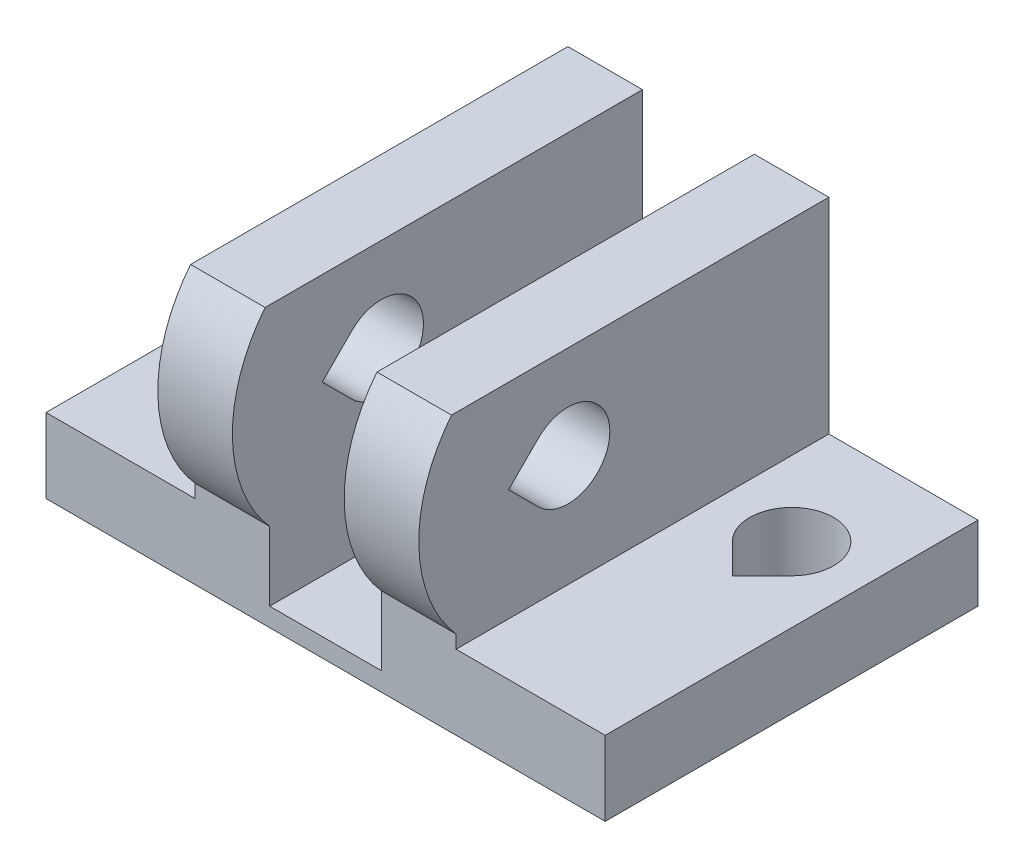
ISO-10303-21;
HEADER;
FILE_DESCRIPTION(('STEP AP214'),'2;1');
FILE_NAME('part.step','',(''),(''),'','','');
FILE_SCHEMA(('AUTOMOTIVE_DESIGN { 1 0 10303 214 1 1 1 1 }'));
ENDSEC;
DATA;
#1=APPLICATION_CONTEXT('core data for automotive mechanical design processes');
#2=APPLICATION_PROTOCOL_DEFINITION('international standard','automotive_design',2000,#1);
#3=PRODUCT_CONTEXT('',#1,'mechanical');
#4=PRODUCT('Part','Part','',(#3));
#5=PRODUCT_RELATED_PRODUCT_CATEGORY('part','',(#4));
#6=PRODUCT_DEFINITION_FORMATION('','',#4);
#7=PRODUCT_DEFINITION_CONTEXT('part definition',#1,'design');
#8=PRODUCT_DEFINITION('design','',#6,#7);
#9=PRODUCT_DEFINITION_SHAPE('','',#8);
#10=(LENGTH_UNIT() NAMED_UNIT(*) SI_UNIT(.MILLI.,.METRE.));
#11=(NAMED_UNIT(*) PLANE_ANGLE_UNIT() SI_UNIT($,.RADIAN.));
#12=(NAMED_UNIT(*) SI_UNIT($,.STERADIAN.) SOLID_ANGLE_UNIT());
#13=UNCERTAINTY_MEASURE_WITH_UNIT(LENGTH_MEASURE(1.E-05),#10,'distance_accuracy_value','');
#14=(GEOMETRIC_REPRESENTATION_CONTEXT(3) GLOBAL_UNCERTAINTY_ASSIGNED_CONTEXT((#13)) GLOBAL_UNIT_ASSIGNED_CONTEXT((#10,
#11,#12)) REPRESENTATION_CONTEXT('',''));
#15=CARTESIAN_POINT('',(0.,0.,0.));
#16=DIRECTION('',(0.,0.,1.));
#17=DIRECTION('',(1.,0.,0.));
#18=AXIS2_PLACEMENT_3D('',#15,#16,#17);
#19=CARTESIAN_POINT('',(0.,0.,20.));
#20=DIRECTION('',(0.,0.,1.));
#21=DIRECTION('',(1.,0.,0.));
#22=AXIS2_PLACEMENT_3D('',#19,#20,#21);
#23=PLANE('',#22);
#24=DIRECTION('',(0.,1.,0.));
#25=VECTOR('',#24,1.);
#26=CARTESIAN_POINT('',(-3.,4.,20.));
#27=LINE('',#26,#25);
#28=CARTESIAN_POINT('',(-3.,1.,20.));
#29=VERTEX_POINT('',#28);
#30=CARTESIAN_POINT('',(-3.,4.70849737787082,20.));
#31=VERTEX_POINT('',#30);
#32=EDGE_CURVE('E47',#29,#31,#27,.T.);
#33=ORIENTED_EDGE('',*,*,#32,.T.);
#34=DIRECTION('',(-1.,0.,0.));
#35=VECTOR('',#34,1.);
#36=CARTESIAN_POINT('',(-3.,4.70849737787082,20.));
#37=LINE('',#36,#35);
#38=CARTESIAN_POINT('',(-7.,4.70849737787082,20.));
#39=VERTEX_POINT('',#38);
#40=EDGE_CURVE('E237',#31,#39,#37,.T.);
#41=ORIENTED_EDGE('',*,*,#40,.T.);
#42=DIRECTION('',(0.,-1.,0.));
#43=VECTOR('',#42,1.);
#44=CARTESIAN_POINT('',(-7.,15.,20.));
#45=LINE('',#44,#43);
#46=CARTESIAN_POINT('',(-7.,4.,20.));
#47=VERTEX_POINT('',#46);
#48=EDGE_CURVE('E372',#39,#47,#45,.T.);
#49=ORIENTED_EDGE('',*,*,#48,.T.);
#50=DIRECTION('',(-1.,0.,0.));
#51=VECTOR('',#50,1.);
#52=CARTESIAN_POINT('',(-7.,4.,20.));
#53=LINE('',#52,#51);
#54=CARTESIAN_POINT('',(-15.,4.,20.));
#55=VERTEX_POINT('',#54);
#56=EDGE_CURVE('E374',#47,#55,#53,.T.);
#57=ORIENTED_EDGE('',*,*,#56,.T.);
#58=DIRECTION('',(0.,-1.,0.));
#59=VECTOR('',#58,1.);
#60=CARTESIAN_POINT('',(-15.,4.,20.));
#61=LINE('',#60,#59);
#62=CARTESIAN_POINT('',(-15.,0.,20.));
#63=VERTEX_POINT('',#62);
#64=EDGE_CURVE('E358',#55,#63,#61,.T.);
#65=ORIENTED_EDGE('',*,*,#64,.T.);
#66=DIRECTION('',(1.,0.,0.));
#67=VECTOR('',#66,1.);
#68=CARTESIAN_POINT('',(-15.,0.,20.));
#69=LINE('',#68,#67);
#70=CARTESIAN_POINT('',(15.,0.,20.));
#71=VERTEX_POINT('',#70);
#72=EDGE_CURVE('E361',#63,#71,#69,.T.);
#73=ORIENTED_EDGE('',*,*,#72,.T.);
#74=DIRECTION('',(0.,1.,0.));
#75=VECTOR('',#74,1.);
#76=CARTESIAN_POINT('',(15.,0.,20.));
#77=LINE('',#76,#75);
#78=CARTESIAN_POINT('',(15.,4.,20.));
#79=VERTEX_POINT('',#78);
#80=EDGE_CURVE('E364',#71,#79,#77,.T.);
#81=ORIENTED_EDGE('',*,*,#80,.T.);
#82=DIRECTION('',(-1.,0.,0.));
#83=VECTOR('',#82,1.);
#84=CARTESIAN_POINT('',(15.,4.,20.));
#85=LINE('',#84,#83);
#86=CARTESIAN_POINT('',(7.,4.,20.));
#87=VERTEX_POINT('',#86);
#88=EDGE_CURVE('E366',#79,#87,#85,.T.);
#89=ORIENTED_EDGE('',*,*,#88,.T.);
#90=DIRECTION('',(0.,1.,0.));
#91=VECTOR('',#90,1.);
#92=CARTESIAN_POINT('',(7.,4.,20.));
#93=LINE('',#92,#91);
#94=CARTESIAN_POINT('',(7.,4.70849737787082,20.));
#95=VERTEX_POINT('',#94);
#96=EDGE_CURVE('E54',#87,#95,#93,.T.);
#97=ORIENTED_EDGE('',*,*,#96,.T.);
#98=DIRECTION('',(1.,0.,0.));
#99=VECTOR('',#98,1.);
#100=CARTESIAN_POINT('',(3.,4.70849737787082,20.));
#101=LINE('',#100,#99);
#102=CARTESIAN_POINT('',(3.,4.70849737787082,20.));
#103=VERTEX_POINT('',#102);
#104=EDGE_CURVE('E249',#103,#95,#101,.T.);
#105=ORIENTED_EDGE('',*,*,#104,.F.);
#106=DIRECTION('',(0.,-1.,0.));
#107=VECTOR('',#106,1.);
#108=CARTESIAN_POINT('',(3.,15.,20.));
#109=LINE('',#108,#107);
#110=CARTESIAN_POINT('',(3.,1.,20.));
#111=VERTEX_POINT('',#110);
#112=EDGE_CURVE('E369',#103,#111,#109,.T.);
#113=ORIENTED_EDGE('',*,*,#112,.T.);
#114=DIRECTION('',(-1.,0.,0.));
#115=VECTOR('',#114,1.);
#116=CARTESIAN_POINT('',(28.4558441227157,1.,20.));
#117=LINE('',#116,#115);
#118=EDGE_CURVE('E261',#111,#29,#117,.T.);
#119=ORIENTED_EDGE('',*,*,#118,.T.);
#120=EDGE_LOOP('',(#33,#41,#49,#57,#65,#73,#81,#89,#97,#105,#113,#119));
#121=FACE_BOUND('',#120,.T.);
#122=ADVANCED_FACE('F32',(#121),#23,.T.);
#123=CARTESIAN_POINT('',(3.,4.,20.));
#124=DIRECTION('',(0.,-1.,0.));
#125=DIRECTION('',(0.,0.,-1.));
#126=AXIS2_PLACEMENT_3D('',#123,#124,#125);
#127=PLANE('',#126);
#128=DIRECTION('',(-1.,0.,0.));
#129=VECTOR('',#128,1.);
#130=CARTESIAN_POINT('',(28.4558441227157,4.,7.29179606750064));
#131=LINE('',#130,#129);
#132=CARTESIAN_POINT('',(3.,4.,7.29179606750064));
#133=VERTEX_POINT('',#132);
#134=CARTESIAN_POINT('',(-3.,4.,7.29179606750064));
#135=VERTEX_POINT('',#134);
#136=EDGE_CURVE('E267',#133,#135,#131,.T.);
#137=ORIENTED_EDGE('',*,*,#136,.F.);
#138=DIRECTION('',(0.,0.,-1.));
#139=VECTOR('',#138,1.);
#140=CARTESIAN_POINT('',(3.,4.,20.));
#141=LINE('',#140,#139);
#142=CARTESIAN_POINT('',(3.,4.,0.));
#143=VERTEX_POINT('',#142);
#144=EDGE_CURVE('E409',#133,#143,#141,.T.);
#145=ORIENTED_EDGE('',*,*,#144,.T.);
#146=DIRECTION('',(-1.,0.,0.));
#147=VECTOR('',#146,1.);
#148=CARTESIAN_POINT('',(3.,4.,0.));
#149=LINE('',#148,#147);
#150=CARTESIAN_POINT('',(-3.,4.,0.));
#151=VERTEX_POINT('',#150);
#152=EDGE_CURVE('E393',#143,#151,#149,.T.);
#153=ORIENTED_EDGE('',*,*,#152,.T.);
#154=DIRECTION('',(0.,0.,-1.));
#155=VECTOR('',#154,1.);
#156=CARTESIAN_POINT('',(-3.,4.,20.));
#157=LINE('',#156,#155);
#158=EDGE_CURVE('E227',#135,#151,#157,.T.);
#159=ORIENTED_EDGE('',*,*,#158,.F.);
#160=EDGE_LOOP('',(#137,#145,#153,#159));
#161=FACE_BOUND('',#160,.T.);
#162=ADVANCED_FACE('F465',(#161),#127,.F.);
#163=CARTESIAN_POINT('',(-15.,4.,20.));
#164=DIRECTION('',(1.,0.,0.));
#165=DIRECTION('',(0.,0.,-1.));
#166=AXIS2_PLACEMENT_3D('',#163,#164,#165);
#167=PLANE('',#166);
#168=DIRECTION('',(0.,-1.,0.));
#169=VECTOR('',#168,1.);
#170=CARTESIAN_POINT('',(-15.,4.,0.));
#171=LINE('',#170,#169);
#172=CARTESIAN_POINT('',(-15.,4.,0.));
#173=VERTEX_POINT('',#172);
#174=CARTESIAN_POINT('',(-15.,0.,0.));
#175=VERTEX_POINT('',#174);
#176=EDGE_CURVE('E353',#173,#175,#171,.T.);
#177=ORIENTED_EDGE('',*,*,#176,.T.);
#178=DIRECTION('',(0.,0.,-1.));
#179=VECTOR('',#178,1.);
#180=CARTESIAN_POINT('',(-15.,0.,20.));
#181=LINE('',#180,#179);
#182=EDGE_CURVE('E425',#63,#175,#181,.T.);
#183=ORIENTED_EDGE('',*,*,#182,.F.);
#184=ORIENTED_EDGE('',*,*,#64,.F.);
#185=DIRECTION('',(0.,0.,-1.));
#186=VECTOR('',#185,1.);
#187=CARTESIAN_POINT('',(-15.,4.,20.));
#188=LINE('',#187,#186);
#189=EDGE_CURVE('E376',#55,#173,#188,.T.);
#190=ORIENTED_EDGE('',*,*,#189,.T.);
#191=EDGE_LOOP('',(#177,#183,#184,#190));
#192=FACE_BOUND('',#191,.T.);
#193=ADVANCED_FACE('F34',(#192),#167,.F.);
#194=CARTESIAN_POINT('',(-15.,0.,20.));
#195=DIRECTION('',(0.,1.,0.));
#196=DIRECTION('',(0.,0.,1.));
#197=AXIS2_PLACEMENT_3D('',#194,#195,#196);
#198=PLANE('',#197);
#199=DIRECTION('',(0.707106781186544,0.,-0.707106781186551));
#200=VECTOR('',#199,1.);
#201=CARTESIAN_POINT('',(-11.,0.,9.18198051533947));
#202=LINE('',#201,#200);
#203=CARTESIAN_POINT('',(-11.,0.,9.18198051533947));
#204=VERTEX_POINT('',#203);
#205=CARTESIAN_POINT('',(-9.40900974233026,0.,7.59099025766973));
#206=VERTEX_POINT('',#205);
#207=EDGE_CURVE('E317',#204,#206,#202,.T.);
#208=ORIENTED_EDGE('',*,*,#207,.T.);
#209=CARTESIAN_POINT('',(-11.,0.,6.));
#210=DIRECTION('',(0.,1.,0.));
#211=DIRECTION('',(0.,0.,1.));
#212=AXIS2_PLACEMENT_3D('',#209,#210,#211);
#213=CIRCLE('',#212,2.25);
#214=CARTESIAN_POINT('',(-12.5909902576697,0.,7.59099025766974));
#215=VERTEX_POINT('',#214);
#216=EDGE_CURVE('E310',#206,#215,#213,.T.);
#217=ORIENTED_EDGE('',*,*,#216,.T.);
#218=DIRECTION('',(0.70710678118655,0.,0.707106781186545));
#219=VECTOR('',#218,1.);
#220=CARTESIAN_POINT('',(-12.5909902576697,0.,7.59099025766974));
#221=LINE('',#220,#219);
#222=EDGE_CURVE('E313',#215,#204,#221,.T.);
#223=ORIENTED_EDGE('',*,*,#222,.T.);
#224=EDGE_LOOP('',(#208,#217,#223));
#225=FACE_BOUND('',#224,.T.);
#226=DIRECTION('',(0.707106781186547,0.,-0.707106781186548));
#227=VECTOR('',#226,1.);
#228=CARTESIAN_POINT('',(11.,0.,9.18198051533947));
#229=LINE('',#228,#227);
#230=CARTESIAN_POINT('',(11.,0.,9.18198051533946));
#231=VERTEX_POINT('',#230);
#232=CARTESIAN_POINT('',(12.5909902576697,0.,7.59099025766973));
#233=VERTEX_POINT('',#232);
#234=EDGE_CURVE('E341',#231,#233,#229,.T.);
#235=ORIENTED_EDGE('',*,*,#234,.T.);
#236=CARTESIAN_POINT('',(11.,0.,6.));
#237=DIRECTION('',(0.,1.,0.));
#238=DIRECTION('',(0.,0.,1.));
#239=AXIS2_PLACEMENT_3D('',#236,#237,#238);
#240=CIRCLE('',#239,2.25);
#241=CARTESIAN_POINT('',(9.40900974233028,0.,7.59099025766973));
#242=VERTEX_POINT('',#241);
#243=EDGE_CURVE('E334',#233,#242,#240,.T.);
#244=ORIENTED_EDGE('',*,*,#243,.T.);
#245=DIRECTION('',(0.707106781186548,0.,0.707106781186547));
#246=VECTOR('',#245,1.);
#247=CARTESIAN_POINT('',(9.40900974233028,0.,7.59099025766973));
#248=LINE('',#247,#246);
#249=EDGE_CURVE('E337',#242,#231,#248,.T.);
#250=ORIENTED_EDGE('',*,*,#249,.T.);
#251=EDGE_LOOP('',(#235,#244,#250));
#252=FACE_BOUND('',#251,.T.);
#253=DIRECTION('',(1.,0.,0.));
#254=VECTOR('',#253,1.);
#255=CARTESIAN_POINT('',(-15.,0.,0.));
#256=LINE('',#255,#254);
#257=CARTESIAN_POINT('',(15.,0.,0.));
#258=VERTEX_POINT('',#257);
#259=EDGE_CURVE('E379',#175,#258,#256,.T.);
#260=ORIENTED_EDGE('',*,*,#259,.T.);
#261=DIRECTION('',(0.,0.,-1.));
#262=VECTOR('',#261,1.);
#263=CARTESIAN_POINT('',(15.,0.,20.));
#264=LINE('',#263,#262);
#265=EDGE_CURVE('E422',#71,#258,#264,.T.);
#266=ORIENTED_EDGE('',*,*,#265,.F.);
#267=ORIENTED_EDGE('',*,*,#72,.F.);
#268=ORIENTED_EDGE('',*,*,#182,.T.);
#269=EDGE_LOOP('',(#260,#266,#267,#268));
#270=FACE_BOUND('',#269,.T.);
#271=ADVANCED_FACE('F508',(#225,#252,#270),#198,.F.);
#272=CARTESIAN_POINT('',(15.,0.,20.));
#273=DIRECTION('',(-1.,0.,0.));
#274=DIRECTION('',(0.,0.,1.));
#275=AXIS2_PLACEMENT_3D('',#272,#273,#274);
#276=PLANE('',#275);
#277=DIRECTION('',(0.,1.,0.));
#278=VECTOR('',#277,1.);
#279=CARTESIAN_POINT('',(15.,0.,0.));
#280=LINE('',#279,#278);
#281=CARTESIAN_POINT('',(15.,4.,0.));
#282=VERTEX_POINT('',#281);
#283=EDGE_CURVE('E381',#258,#282,#280,.T.);
#284=ORIENTED_EDGE('',*,*,#283,.T.);
#285=DIRECTION('',(0.,0.,-1.));
#286=VECTOR('',#285,1.);
#287=CARTESIAN_POINT('',(15.,4.,20.));
#288=LINE('',#287,#286);
#289=EDGE_CURVE('E419',#79,#282,#288,.T.);
#290=ORIENTED_EDGE('',*,*,#289,.F.);
#291=ORIENTED_EDGE('',*,*,#80,.F.);
#292=ORIENTED_EDGE('',*,*,#265,.T.);
#293=EDGE_LOOP('',(#284,#290,#291,#292));
#294=FACE_BOUND('',#293,.T.);
#295=ADVANCED_FACE('F505',(#294),#276,.F.);
#296=CARTESIAN_POINT('',(15.,4.,20.));
#297=DIRECTION('',(0.,-1.,0.));
#298=DIRECTION('',(0.,0.,-1.));
#299=AXIS2_PLACEMENT_3D('',#296,#297,#298);
#300=PLANE('',#299);
#301=DIRECTION('',(0.707106781186548,0.,0.707106781186547));
#302=VECTOR('',#301,1.);
#303=CARTESIAN_POINT('',(9.40900974233028,4.,7.59099025766973));
#304=LINE('',#303,#302);
#305=CARTESIAN_POINT('',(9.40900974233028,4.,7.59099025766974));
#306=VERTEX_POINT('',#305);
#307=CARTESIAN_POINT('',(11.,4.,9.18198051533947));
#308=VERTEX_POINT('',#307);
#309=EDGE_CURVE('E346',#306,#308,#304,.T.);
#310=ORIENTED_EDGE('',*,*,#309,.F.);
#311=CARTESIAN_POINT('',(11.,4.,6.));
#312=DIRECTION('',(0.,1.,0.));
#313=DIRECTION('',(0.,0.,1.));
#314=AXIS2_PLACEMENT_3D('',#311,#312,#313);
#315=CIRCLE('',#314,2.25);
#316=CARTESIAN_POINT('',(12.5909902576697,4.,7.59099025766973));
#317=VERTEX_POINT('',#316);
#318=EDGE_CURVE('E329',#317,#306,#315,.T.);
#319=ORIENTED_EDGE('',*,*,#318,.F.);
#320=DIRECTION('',(0.707106781186547,0.,-0.707106781186548));
#321=VECTOR('',#320,1.);
#322=CARTESIAN_POINT('',(11.,4.,9.18198051533947));
#323=LINE('',#322,#321);
#324=EDGE_CURVE('E338',#308,#317,#323,.T.);
#325=ORIENTED_EDGE('',*,*,#324,.F.);
#326=EDGE_LOOP('',(#310,#319,#325));
#327=FACE_BOUND('',#326,.T.);
#328=DIRECTION('',(-1.,0.,0.));
#329=VECTOR('',#328,1.);
#330=CARTESIAN_POINT('',(15.,4.,0.));
#331=LINE('',#330,#329);
#332=CARTESIAN_POINT('',(7.,4.,0.));
#333=VERTEX_POINT('',#332);
#334=EDGE_CURVE('E383',#282,#333,#331,.T.);
#335=ORIENTED_EDGE('',*,*,#334,.T.);
#336=DIRECTION('',(0.,0.,-1.));
#337=VECTOR('',#336,1.);
#338=CARTESIAN_POINT('',(7.,4.,20.));
#339=LINE('',#338,#337);
#340=EDGE_CURVE('E416',#87,#333,#339,.T.);
#341=ORIENTED_EDGE('',*,*,#340,.F.);
#342=ORIENTED_EDGE('',*,*,#88,.F.);
#343=ORIENTED_EDGE('',*,*,#289,.T.);
#344=EDGE_LOOP('',(#335,#341,#342,#343));
#345=FACE_BOUND('',#344,.T.);
#346=ADVANCED_FACE('F501',(#327,#345),#300,.F.);
#347=CARTESIAN_POINT('',(7.,4.,20.));
#348=DIRECTION('',(-1.,0.,0.));
#349=DIRECTION('',(0.,-1.,0.));
#350=AXIS2_PLACEMENT_3D('',#347,#348,#349);
#351=PLANE('',#350);
#352=DIRECTION('',(0.,-0.707106781186547,0.707106781186548));
#353=VECTOR('',#352,1.);
#354=CARTESIAN_POINT('',(7.,11.5909902576697,15.5909902576697));
#355=LINE('',#354,#353);
#356=CARTESIAN_POINT('',(7.,11.5909902576697,15.5909902576697));
#357=VERTEX_POINT('',#356);
#358=CARTESIAN_POINT('',(7.,10.,17.1819805153395));
#359=VERTEX_POINT('',#358);
#360=EDGE_CURVE('E275',#357,#359,#355,.T.);
#361=ORIENTED_EDGE('',*,*,#360,.F.);
#362=CARTESIAN_POINT('',(7.,10.,14.));
#363=DIRECTION('',(1.,0.,0.));
#364=DIRECTION('',(0.,1.,0.));
#365=AXIS2_PLACEMENT_3D('',#362,#363,#364);
#366=CIRCLE('',#365,2.25);
#367=CARTESIAN_POINT('',(7.,8.40900974233027,15.5909902576697));
#368=VERTEX_POINT('',#367);
#369=EDGE_CURVE('E273',#368,#357,#366,.T.);
#370=ORIENTED_EDGE('',*,*,#369,.F.);
#371=DIRECTION('',(0.,-0.707106781186549,-0.707106781186546));
#372=VECTOR('',#371,1.);
#373=CARTESIAN_POINT('',(7.,10.,17.1819805153395));
#374=LINE('',#373,#372);
#375=EDGE_CURVE('E278',#359,#368,#374,.T.);
#376=ORIENTED_EDGE('',*,*,#375,.F.);
#377=EDGE_LOOP('',(#361,#370,#376));
#378=FACE_BOUND('',#377,.T.);
#379=DIRECTION('',(0.,1.,0.));
#380=VECTOR('',#379,1.);
#381=CARTESIAN_POINT('',(7.,4.,0.));
#382=LINE('',#381,#380);
#383=CARTESIAN_POINT('',(7.,15.,0.));
#384=VERTEX_POINT('',#383);
#385=EDGE_CURVE('E385',#333,#384,#382,.T.);
#386=ORIENTED_EDGE('',*,*,#385,.T.);
#387=DIRECTION('',(0.,0.,-1.));
#388=VECTOR('',#387,1.);
#389=CARTESIAN_POINT('',(7.,15.,20.));
#390=LINE('',#389,#388);
#391=CARTESIAN_POINT('',(7.,15.,20.2449979983984));
#392=VERTEX_POINT('',#391);
#393=EDGE_CURVE('E413',#392,#384,#390,.T.);
#394=ORIENTED_EDGE('',*,*,#393,.F.);
#395=CARTESIAN_POINT('',(7.,10.,14.));
#396=DIRECTION('',(1.,0.,0.));
#397=DIRECTION('',(0.,1.,0.));
#398=AXIS2_PLACEMENT_3D('',#395,#396,#397);
#399=CIRCLE('',#398,8.);
#400=EDGE_CURVE('E244',#392,#95,#399,.T.);
#401=ORIENTED_EDGE('',*,*,#400,.T.);
#402=ORIENTED_EDGE('',*,*,#96,.F.);
#403=ORIENTED_EDGE('',*,*,#340,.T.);
#404=EDGE_LOOP('',(#386,#394,#401,#402,#403));
#405=FACE_BOUND('',#404,.T.);
#406=ADVANCED_FACE('F497',(#378,#405),#351,.F.);
#407=CARTESIAN_POINT('',(7.,15.,20.));
#408=DIRECTION('',(0.,-1.,0.));
#409=DIRECTION('',(1.,0.,0.));
#410=AXIS2_PLACEMENT_3D('',#407,#408,#409);
#411=PLANE('',#410);
#412=DIRECTION('',(-1.,0.,0.));
#413=VECTOR('',#412,1.);
#414=CARTESIAN_POINT('',(7.,15.,0.));
#415=LINE('',#414,#413);
#416=CARTESIAN_POINT('',(3.,15.,0.));
#417=VERTEX_POINT('',#416);
#418=EDGE_CURVE('E387',#384,#417,#415,.T.);
#419=ORIENTED_EDGE('',*,*,#418,.T.);
#420=DIRECTION('',(0.,0.,-1.));
#421=VECTOR('',#420,1.);
#422=CARTESIAN_POINT('',(3.,15.,20.));
#423=LINE('',#422,#421);
#424=CARTESIAN_POINT('',(3.,15.,20.2449979983984));
#425=VERTEX_POINT('',#424);
#426=EDGE_CURVE('E411',#425,#417,#423,.T.);
#427=ORIENTED_EDGE('',*,*,#426,.F.);
#428=DIRECTION('',(1.,0.,0.));
#429=VECTOR('',#428,1.);
#430=CARTESIAN_POINT('',(3.,15.,20.2449979983984));
#431=LINE('',#430,#429);
#432=EDGE_CURVE('E252',#425,#392,#431,.T.);
#433=ORIENTED_EDGE('',*,*,#432,.T.);
#434=ORIENTED_EDGE('',*,*,#393,.T.);
#435=EDGE_LOOP('',(#419,#427,#433,#434));
#436=FACE_BOUND('',#435,.T.);
#437=ADVANCED_FACE('F493',(#436),#411,.F.);
#438=CARTESIAN_POINT('',(3.,15.,20.));
#439=DIRECTION('',(1.,0.,0.));
#440=DIRECTION('',(0.,1.,0.));
#441=AXIS2_PLACEMENT_3D('',#438,#439,#440);
#442=PLANE('',#441);
#443=DIRECTION('',(0.,-0.707106781186549,-0.707106781186546));
#444=VECTOR('',#443,1.);
#445=CARTESIAN_POINT('',(3.,13.9090097423303,21.0909902576697));
#446=LINE('',#445,#444);
#447=CARTESIAN_POINT('',(3.,10.,17.1819805153395));
#448=VERTEX_POINT('',#447);
#449=CARTESIAN_POINT('',(3.,8.40900974233027,15.5909902576697));
#450=VERTEX_POINT('',#449);
#451=EDGE_CURVE('E300',#448,#450,#446,.T.);
#452=ORIENTED_EDGE('',*,*,#451,.T.);
#453=CARTESIAN_POINT('',(3.,10.,14.));
#454=DIRECTION('',(1.,0.,0.));
#455=DIRECTION('',(0.,1.,0.));
#456=AXIS2_PLACEMENT_3D('',#453,#454,#455);
#457=CIRCLE('',#456,2.25);
#458=CARTESIAN_POINT('',(3.,11.5909902576697,15.5909902576697));
#459=VERTEX_POINT('',#458);
#460=EDGE_CURVE('E306',#450,#459,#457,.T.);
#461=ORIENTED_EDGE('',*,*,#460,.T.);
#462=DIRECTION('',(0.,-0.707106781186547,0.707106781186548));
#463=VECTOR('',#462,1.);
#464=CARTESIAN_POINT('',(3.,11.0909902576697,16.0909902576697));
#465=LINE('',#464,#463);
#466=EDGE_CURVE('E294',#459,#448,#465,.T.);
#467=ORIENTED_EDGE('',*,*,#466,.T.);
#468=EDGE_LOOP('',(#452,#461,#467));
#469=FACE_BOUND('',#468,.T.);
#470=ORIENTED_EDGE('',*,*,#426,.T.);
#471=DIRECTION('',(0.,-1.,0.));
#472=VECTOR('',#471,1.);
#473=CARTESIAN_POINT('',(3.,15.,0.));
#474=LINE('',#473,#472);
#475=EDGE_CURVE('E390',#417,#143,#474,.T.);
#476=ORIENTED_EDGE('',*,*,#475,.T.);
#477=ORIENTED_EDGE('',*,*,#144,.F.);
#478=CARTESIAN_POINT('',(3.,10.,14.));
#479=DIRECTION('',(1.,0.,0.));
#480=DIRECTION('',(0.,1.,0.));
#481=AXIS2_PLACEMENT_3D('',#478,#479,#480);
#482=CIRCLE('',#481,9.);
#483=CARTESIAN_POINT('',(3.,1.,14.));
#484=VERTEX_POINT('',#483);
#485=EDGE_CURVE('E265',#484,#133,#482,.T.);
#486=ORIENTED_EDGE('',*,*,#485,.F.);
#487=DIRECTION('',(0.,0.,-1.));
#488=VECTOR('',#487,1.);
#489=CARTESIAN_POINT('',(3.,1.,14.));
#490=LINE('',#489,#488);
#491=EDGE_CURVE('E260',#111,#484,#490,.T.);
#492=ORIENTED_EDGE('',*,*,#491,.F.);
#493=ORIENTED_EDGE('',*,*,#112,.F.);
#494=CARTESIAN_POINT('',(3.,10.,14.));
#495=DIRECTION('',(1.,0.,0.));
#496=DIRECTION('',(0.,1.,0.));
#497=AXIS2_PLACEMENT_3D('',#494,#495,#496);
#498=CIRCLE('',#497,8.);
#499=EDGE_CURVE('E246',#425,#103,#498,.T.);
#500=ORIENTED_EDGE('',*,*,#499,.F.);
#501=EDGE_LOOP('',(#470,#476,#477,#486,#492,#493,#500));
#502=FACE_BOUND('',#501,.T.);
#503=ADVANCED_FACE('F489',(#469,#502),#442,.F.);
#504=CARTESIAN_POINT('',(-3.,4.,20.));
#505=DIRECTION('',(-1.,0.,0.));
#506=DIRECTION('',(0.,-1.,0.));
#507=AXIS2_PLACEMENT_3D('',#504,#505,#506);
#508=PLANE('',#507);
#509=DIRECTION('',(0.,0.707106781186547,-0.707106781186548));
#510=VECTOR('',#509,1.);
#511=CARTESIAN_POINT('',(-3.,5.59099025766974,21.5909902576697));
#512=LINE('',#511,#510);
#513=CARTESIAN_POINT('',(-3.,10.,17.1819805153395));
#514=VERTEX_POINT('',#513);
#515=CARTESIAN_POINT('',(-3.,11.5909902576697,15.5909902576697));
#516=VERTEX_POINT('',#515);
#517=EDGE_CURVE('E291',#514,#516,#512,.T.);
#518=ORIENTED_EDGE('',*,*,#517,.T.);
#519=CARTESIAN_POINT('',(-3.,10.,14.));
#520=DIRECTION('',(-1.,0.,0.));
#521=DIRECTION('',(0.,-1.,0.));
#522=AXIS2_PLACEMENT_3D('',#519,#520,#521);
#523=CIRCLE('',#522,2.25);
#524=CARTESIAN_POINT('',(-3.,8.40900974233027,15.5909902576697));
#525=VERTEX_POINT('',#524);
#526=EDGE_CURVE('E303',#516,#525,#523,.T.);
#527=ORIENTED_EDGE('',*,*,#526,.T.);
#528=DIRECTION('',(0.,0.707106781186549,0.707106781186546));
#529=VECTOR('',#528,1.);
#530=CARTESIAN_POINT('',(-3.,8.40900974233026,15.5909902576697));
#531=LINE('',#530,#529);
#532=EDGE_CURVE('E297',#525,#514,#531,.T.);
#533=ORIENTED_EDGE('',*,*,#532,.T.);
#534=EDGE_LOOP('',(#518,#527,#533));
#535=FACE_BOUND('',#534,.T.);
#536=ORIENTED_EDGE('',*,*,#32,.F.);
#537=DIRECTION('',(0.,0.,-1.));
#538=VECTOR('',#537,1.);
#539=CARTESIAN_POINT('',(-3.,1.,14.));
#540=LINE('',#539,#538);
#541=CARTESIAN_POINT('',(-3.,1.,14.));
#542=VERTEX_POINT('',#541);
#543=EDGE_CURVE('E257',#29,#542,#540,.T.);
#544=ORIENTED_EDGE('',*,*,#543,.T.);
#545=CARTESIAN_POINT('',(-3.,10.,14.));
#546=DIRECTION('',(1.,0.,0.));
#547=DIRECTION('',(0.,1.,0.));
#548=AXIS2_PLACEMENT_3D('',#545,#546,#547);
#549=CIRCLE('',#548,9.);
#550=EDGE_CURVE('E262',#542,#135,#549,.T.);
#551=ORIENTED_EDGE('',*,*,#550,.T.);
#552=ORIENTED_EDGE('',*,*,#158,.T.);
#553=DIRECTION('',(0.,1.,0.));
#554=VECTOR('',#553,1.);
#555=CARTESIAN_POINT('',(-3.,4.,0.));
#556=LINE('',#555,#554);
#557=CARTESIAN_POINT('',(-3.,15.,0.));
#558=VERTEX_POINT('',#557);
#559=EDGE_CURVE('E224',#151,#558,#556,.T.);
#560=ORIENTED_EDGE('',*,*,#559,.T.);
#561=DIRECTION('',(0.,0.,-1.));
#562=VECTOR('',#561,1.);
#563=CARTESIAN_POINT('',(-3.,15.,20.));
#564=LINE('',#563,#562);
#565=CARTESIAN_POINT('',(-3.,15.,20.2449979983984));
#566=VERTEX_POINT('',#565);
#567=EDGE_CURVE('E217',#566,#558,#564,.T.);
#568=ORIENTED_EDGE('',*,*,#567,.F.);
#569=CARTESIAN_POINT('',(-3.,10.,14.));
#570=DIRECTION('',(1.,0.,0.));
#571=DIRECTION('',(0.,1.,0.));
#572=AXIS2_PLACEMENT_3D('',#569,#570,#571);
#573=CIRCLE('',#572,8.);
#574=EDGE_CURVE('E221',#566,#31,#573,.T.);
#575=ORIENTED_EDGE('',*,*,#574,.T.);
#576=EDGE_LOOP('',(#536,#544,#551,#552,#560,#568,#575));
#577=FACE_BOUND('',#576,.T.);
#578=ADVANCED_FACE('F219',(#535,#577),#508,.F.);
#579=CARTESIAN_POINT('',(-3.,15.,20.));
#580=DIRECTION('',(0.,-1.,0.));
#581=DIRECTION('',(1.,0.,0.));
#582=AXIS2_PLACEMENT_3D('',#579,#580,#581);
#583=PLANE('',#582);
#584=DIRECTION('',(-1.,0.,0.));
#585=VECTOR('',#584,1.);
#586=CARTESIAN_POINT('',(-3.,15.,0.));
#587=LINE('',#586,#585);
#588=CARTESIAN_POINT('',(-7.,15.,0.));
#589=VERTEX_POINT('',#588);
#590=EDGE_CURVE('E397',#558,#589,#587,.T.);
#591=ORIENTED_EDGE('',*,*,#590,.T.);
#592=DIRECTION('',(0.,0.,-1.));
#593=VECTOR('',#592,1.);
#594=CARTESIAN_POINT('',(-7.,15.,20.));
#595=LINE('',#594,#593);
#596=CARTESIAN_POINT('',(-7.,15.,20.2449979983984));
#597=VERTEX_POINT('',#596);
#598=EDGE_CURVE('E228',#597,#589,#595,.T.);
#599=ORIENTED_EDGE('',*,*,#598,.F.);
#600=DIRECTION('',(-1.,0.,0.));
#601=VECTOR('',#600,1.);
#602=CARTESIAN_POINT('',(-3.,15.,20.2449979983984));
#603=LINE('',#602,#601);
#604=EDGE_CURVE('E231',#566,#597,#603,.T.);
#605=ORIENTED_EDGE('',*,*,#604,.F.);
#606=ORIENTED_EDGE('',*,*,#567,.T.);
#607=EDGE_LOOP('',(#591,#599,#605,#606));
#608=FACE_BOUND('',#607,.T.);
#609=ADVANCED_FACE('F232',(#608),#583,.F.);
#610=CARTESIAN_POINT('',(-7.,15.,20.));
#611=DIRECTION('',(1.,0.,0.));
#612=DIRECTION('',(0.,1.,0.));
#613=AXIS2_PLACEMENT_3D('',#610,#611,#612);
#614=PLANE('',#613);
#615=DIRECTION('',(0.,-0.707106781186549,-0.707106781186546));
#616=VECTOR('',#615,1.);
#617=CARTESIAN_POINT('',(-7.,13.9090097423303,21.0909902576697));
#618=LINE('',#617,#616);
#619=CARTESIAN_POINT('',(-7.,10.,17.1819805153395));
#620=VERTEX_POINT('',#619);
#621=CARTESIAN_POINT('',(-7.,8.40900974233027,15.5909902576697));
#622=VERTEX_POINT('',#621);
#623=EDGE_CURVE('E40',#620,#622,#618,.T.);
#624=ORIENTED_EDGE('',*,*,#623,.T.);
#625=CARTESIAN_POINT('',(-7.,10.,14.));
#626=DIRECTION('',(1.,0.,0.));
#627=DIRECTION('',(0.,1.,0.));
#628=AXIS2_PLACEMENT_3D('',#625,#626,#627);
#629=CIRCLE('',#628,2.25);
#630=CARTESIAN_POINT('',(-7.,11.5909902576697,15.5909902576697));
#631=VERTEX_POINT('',#630);
#632=EDGE_CURVE('E11',#622,#631,#629,.T.);
#633=ORIENTED_EDGE('',*,*,#632,.T.);
#634=DIRECTION('',(0.,-0.707106781186547,0.707106781186548));
#635=VECTOR('',#634,1.);
#636=CARTESIAN_POINT('',(-7.,11.0909902576697,16.0909902576697));
#637=LINE('',#636,#635);
#638=EDGE_CURVE('E428',#631,#620,#637,.T.);
#639=ORIENTED_EDGE('',*,*,#638,.T.);
#640=EDGE_LOOP('',(#624,#633,#639));
#641=FACE_BOUND('',#640,.T.);
#642=DIRECTION('',(0.,-1.,0.));
#643=VECTOR('',#642,1.);
#644=CARTESIAN_POINT('',(-7.,15.,0.));
#645=LINE('',#644,#643);
#646=CARTESIAN_POINT('',(-7.,4.,0.));
#647=VERTEX_POINT('',#646);
#648=EDGE_CURVE('E399',#589,#647,#645,.T.);
#649=ORIENTED_EDGE('',*,*,#648,.T.);
#650=DIRECTION('',(0.,0.,-1.));
#651=VECTOR('',#650,1.);
#652=CARTESIAN_POINT('',(-7.,4.,20.));
#653=LINE('',#652,#651);
#654=EDGE_CURVE('E404',#47,#647,#653,.T.);
#655=ORIENTED_EDGE('',*,*,#654,.F.);
#656=ORIENTED_EDGE('',*,*,#48,.F.);
#657=CARTESIAN_POINT('',(-7.,10.,14.));
#658=DIRECTION('',(1.,0.,0.));
#659=DIRECTION('',(0.,1.,0.));
#660=AXIS2_PLACEMENT_3D('',#657,#658,#659);
#661=CIRCLE('',#660,8.);
#662=EDGE_CURVE('E240',#597,#39,#661,.T.);
#663=ORIENTED_EDGE('',*,*,#662,.F.);
#664=ORIENTED_EDGE('',*,*,#598,.T.);
#665=EDGE_LOOP('',(#649,#655,#656,#663,#664));
#666=FACE_BOUND('',#665,.T.);
#667=ADVANCED_FACE('F433',(#641,#666),#614,.F.);
#668=CARTESIAN_POINT('',(-7.,4.,20.));
#669=DIRECTION('',(0.,-1.,0.));
#670=DIRECTION('',(0.,0.,-1.));
#671=AXIS2_PLACEMENT_3D('',#668,#669,#670);
#672=PLANE('',#671);
#673=DIRECTION('',(0.70710678118655,0.,0.707106781186545));
#674=VECTOR('',#673,1.);
#675=CARTESIAN_POINT('',(-12.5909902576697,4.,7.59099025766974));
#676=LINE('',#675,#674);
#677=CARTESIAN_POINT('',(-12.5909902576697,4.,7.59099025766974));
#678=VERTEX_POINT('',#677);
#679=CARTESIAN_POINT('',(-11.,4.,9.18198051533947));
#680=VERTEX_POINT('',#679);
#681=EDGE_CURVE('E322',#678,#680,#676,.T.);
#682=ORIENTED_EDGE('',*,*,#681,.F.);
#683=CARTESIAN_POINT('',(-11.,4.,6.));
#684=DIRECTION('',(0.,1.,0.));
#685=DIRECTION('',(0.,0.,1.));
#686=AXIS2_PLACEMENT_3D('',#683,#684,#685);
#687=CIRCLE('',#686,2.25);
#688=CARTESIAN_POINT('',(-9.40900974233026,4.,7.59099025766973));
#689=VERTEX_POINT('',#688);
#690=EDGE_CURVE('E309',#689,#678,#687,.T.);
#691=ORIENTED_EDGE('',*,*,#690,.F.);
#692=DIRECTION('',(0.707106781186544,0.,-0.707106781186551));
#693=VECTOR('',#692,1.);
#694=CARTESIAN_POINT('',(-11.,4.,9.18198051533947));
#695=LINE('',#694,#693);
#696=EDGE_CURVE('E314',#680,#689,#695,.T.);
#697=ORIENTED_EDGE('',*,*,#696,.F.);
#698=EDGE_LOOP('',(#682,#691,#697));
#699=FACE_BOUND('',#698,.T.);
#700=DIRECTION('',(-1.,0.,0.));
#701=VECTOR('',#700,1.);
#702=CARTESIAN_POINT('',(-7.,4.,0.));
#703=LINE('',#702,#701);
#704=EDGE_CURVE('E362',#647,#173,#703,.T.);
#705=ORIENTED_EDGE('',*,*,#704,.T.);
#706=ORIENTED_EDGE('',*,*,#189,.F.);
#707=ORIENTED_EDGE('',*,*,#56,.F.);
#708=ORIENTED_EDGE('',*,*,#654,.T.);
#709=EDGE_LOOP('',(#705,#706,#707,#708));
#710=FACE_BOUND('',#709,.T.);
#711=ADVANCED_FACE('F479',(#699,#710),#672,.F.);
#712=CARTESIAN_POINT('',(0.,0.,0.));
#713=DIRECTION('',(0.,0.,1.));
#714=DIRECTION('',(1.,0.,0.));
#715=AXIS2_PLACEMENT_3D('',#712,#713,#714);
#716=PLANE('',#715);
#717=ORIENTED_EDGE('',*,*,#176,.F.);
#718=ORIENTED_EDGE('',*,*,#704,.F.);
#719=ORIENTED_EDGE('',*,*,#648,.F.);
#720=ORIENTED_EDGE('',*,*,#590,.F.);
#721=ORIENTED_EDGE('',*,*,#559,.F.);
#722=ORIENTED_EDGE('',*,*,#152,.F.);
#723=ORIENTED_EDGE('',*,*,#475,.F.);
#724=ORIENTED_EDGE('',*,*,#418,.F.);
#725=ORIENTED_EDGE('',*,*,#385,.F.);
#726=ORIENTED_EDGE('',*,*,#334,.F.);
#727=ORIENTED_EDGE('',*,*,#283,.F.);
#728=ORIENTED_EDGE('',*,*,#259,.F.);
#729=EDGE_LOOP('',(#717,#718,#719,#720,#721,#722,#723,#724,#725,#726,#727,#728));
#730=FACE_BOUND('',#729,.T.);
#731=ADVANCED_FACE('F476',(#730),#716,.F.);
#732=CARTESIAN_POINT('',(11.,0.,6.));
#733=DIRECTION('',(0.,1.,0.));
#734=DIRECTION('',(0.,0.,1.));
#735=AXIS2_PLACEMENT_3D('',#732,#733,#734);
#736=CYLINDRICAL_SURFACE('',#735,2.25);
#737=ORIENTED_EDGE('',*,*,#318,.T.);
#738=DIRECTION('',(0.,1.,0.));
#739=VECTOR('',#738,1.);
#740=CARTESIAN_POINT('',(9.40900974233028,0.,7.59099025766973));
#741=LINE('',#740,#739);
#742=EDGE_CURVE('E344',#242,#306,#741,.T.);
#743=ORIENTED_EDGE('',*,*,#742,.F.);
#744=ORIENTED_EDGE('',*,*,#243,.F.);
#745=DIRECTION('',(0.,1.,0.));
#746=VECTOR('',#745,1.);
#747=CARTESIAN_POINT('',(12.5909902576697,0.,7.59099025766973));
#748=LINE('',#747,#746);
#749=EDGE_CURVE('E351',#233,#317,#748,.T.);
#750=ORIENTED_EDGE('',*,*,#749,.T.);
#751=EDGE_LOOP('',(#737,#743,#744,#750));
#752=FACE_BOUND('',#751,.T.);
#753=ADVANCED_FACE('F474',(#752),#736,.F.);
#754=CARTESIAN_POINT('',(11.,0.,9.18198051533947));
#755=DIRECTION('',(0.707106781186548,0.,0.707106781186547));
#756=DIRECTION('',(0.707106781186547,0.,-0.707106781186548));
#757=AXIS2_PLACEMENT_3D('',#754,#755,#756);
#758=PLANE('',#757);
#759=ORIENTED_EDGE('',*,*,#324,.T.);
#760=ORIENTED_EDGE('',*,*,#749,.F.);
#761=ORIENTED_EDGE('',*,*,#234,.F.);
#762=DIRECTION('',(0.,1.,0.));
#763=VECTOR('',#762,1.);
#764=CARTESIAN_POINT('',(11.,0.,9.18198051533947));
#765=LINE('',#764,#763);
#766=EDGE_CURVE('E354',#231,#308,#765,.T.);
#767=ORIENTED_EDGE('',*,*,#766,.T.);
#768=EDGE_LOOP('',(#759,#760,#761,#767));
#769=FACE_BOUND('',#768,.T.);
#770=ADVANCED_FACE('F589',(#769),#758,.F.);
#771=CARTESIAN_POINT('',(9.40900974233028,0.,7.59099025766973));
#772=DIRECTION('',(-0.707106781186547,0.,0.707106781186548));
#773=DIRECTION('',(0.707106781186548,0.,0.707106781186547));
#774=AXIS2_PLACEMENT_3D('',#771,#772,#773);
#775=PLANE('',#774);
#776=ORIENTED_EDGE('',*,*,#309,.T.);
#777=ORIENTED_EDGE('',*,*,#766,.F.);
#778=ORIENTED_EDGE('',*,*,#249,.F.);
#779=ORIENTED_EDGE('',*,*,#742,.T.);
#780=EDGE_LOOP('',(#776,#777,#778,#779));
#781=FACE_BOUND('',#780,.T.);
#782=ADVANCED_FACE('F587',(#781),#775,.F.);
#783=CARTESIAN_POINT('',(-11.,0.,6.));
#784=DIRECTION('',(0.,1.,0.));
#785=DIRECTION('',(0.,0.,1.));
#786=AXIS2_PLACEMENT_3D('',#783,#784,#785);
#787=CYLINDRICAL_SURFACE('',#786,2.25);
#788=ORIENTED_EDGE('',*,*,#690,.T.);
#789=DIRECTION('',(0.,1.,0.));
#790=VECTOR('',#789,1.);
#791=CARTESIAN_POINT('',(-12.5909902576697,0.,7.59099025766974));
#792=LINE('',#791,#790);
#793=EDGE_CURVE('E320',#215,#678,#792,.T.);
#794=ORIENTED_EDGE('',*,*,#793,.F.);
#795=ORIENTED_EDGE('',*,*,#216,.F.);
#796=DIRECTION('',(0.,1.,0.));
#797=VECTOR('',#796,1.);
#798=CARTESIAN_POINT('',(-9.40900974233026,0.,7.59099025766973));
#799=LINE('',#798,#797);
#800=EDGE_CURVE('E327',#206,#689,#799,.T.);
#801=ORIENTED_EDGE('',*,*,#800,.T.);
#802=EDGE_LOOP('',(#788,#794,#795,#801));
#803=FACE_BOUND('',#802,.T.);
#804=ADVANCED_FACE('F582',(#803),#787,.F.);
#805=CARTESIAN_POINT('',(-11.,0.,9.18198051533947));
#806=DIRECTION('',(0.707106781186551,0.,0.707106781186544));
#807=DIRECTION('',(0.707106781186544,0.,-0.707106781186551));
#808=AXIS2_PLACEMENT_3D('',#805,#806,#807);
#809=PLANE('',#808);
#810=ORIENTED_EDGE('',*,*,#696,.T.);
#811=ORIENTED_EDGE('',*,*,#800,.F.);
#812=ORIENTED_EDGE('',*,*,#207,.F.);
#813=DIRECTION('',(0.,1.,0.));
#814=VECTOR('',#813,1.);
#815=CARTESIAN_POINT('',(-11.,0.,9.18198051533947));
#816=LINE('',#815,#814);
#817=EDGE_CURVE('E330',#204,#680,#816,.T.);
#818=ORIENTED_EDGE('',*,*,#817,.T.);
#819=EDGE_LOOP('',(#810,#811,#812,#818));
#820=FACE_BOUND('',#819,.T.);
#821=ADVANCED_FACE('F457',(#820),#809,.F.);
#822=CARTESIAN_POINT('',(-12.5909902576697,0.,7.59099025766974));
#823=DIRECTION('',(-0.707106781186545,0.,0.70710678118655));
#824=DIRECTION('',(0.70710678118655,0.,0.707106781186545));
#825=AXIS2_PLACEMENT_3D('',#822,#823,#824);
#826=PLANE('',#825);
#827=ORIENTED_EDGE('',*,*,#681,.T.);
#828=ORIENTED_EDGE('',*,*,#817,.F.);
#829=ORIENTED_EDGE('',*,*,#222,.F.);
#830=ORIENTED_EDGE('',*,*,#793,.T.);
#831=EDGE_LOOP('',(#827,#828,#829,#830));
#832=FACE_BOUND('',#831,.T.);
#833=ADVANCED_FACE('F448',(#832),#826,.F.);
#834=CARTESIAN_POINT('',(-15.,11.5909902576697,15.5909902576697));
#835=DIRECTION('',(0.,0.707106781186548,0.707106781186547));
#836=DIRECTION('',(0.,-0.707106781186547,0.707106781186548));
#837=AXIS2_PLACEMENT_3D('',#834,#835,#836);
#838=PLANE('',#837);
#839=DIRECTION('',(1.,0.,0.));
#840=VECTOR('',#839,1.);
#841=CARTESIAN_POINT('',(-15.,10.,17.1819805153395));
#842=LINE('',#841,#840);
#843=EDGE_CURVE('E285',#620,#514,#842,.T.);
#844=ORIENTED_EDGE('',*,*,#843,.F.);
#845=ORIENTED_EDGE('',*,*,#638,.F.);
#846=DIRECTION('',(1.,0.,0.));
#847=VECTOR('',#846,1.);
#848=CARTESIAN_POINT('',(-15.,11.5909902576697,15.5909902576697));
#849=LINE('',#848,#847);
#850=EDGE_CURVE('E288',#631,#516,#849,.T.);
#851=ORIENTED_EDGE('',*,*,#850,.T.);
#852=ORIENTED_EDGE('',*,*,#517,.F.);
#853=EDGE_LOOP('',(#844,#845,#851,#852));
#854=FACE_BOUND('',#853,.T.);
#855=ADVANCED_FACE('F446',(#854),#838,.F.);
#856=CARTESIAN_POINT('',(-15.,10.,17.1819805153395));
#857=DIRECTION('',(0.,-0.707106781186546,0.707106781186549));
#858=DIRECTION('',(0.,-0.707106781186549,-0.707106781186546));
#859=AXIS2_PLACEMENT_3D('',#856,#857,#858);
#860=PLANE('',#859);
#861=DIRECTION('',(1.,0.,0.));
#862=VECTOR('',#861,1.);
#863=CARTESIAN_POINT('',(-15.,8.40900974233028,15.5909902576697));
#864=LINE('',#863,#862);
#865=EDGE_CURVE('E284',#622,#525,#864,.T.);
#866=ORIENTED_EDGE('',*,*,#865,.F.);
#867=ORIENTED_EDGE('',*,*,#623,.F.);
#868=ORIENTED_EDGE('',*,*,#843,.T.);
#869=ORIENTED_EDGE('',*,*,#532,.F.);
#870=EDGE_LOOP('',(#866,#867,#868,#869));
#871=FACE_BOUND('',#870,.T.);
#872=ADVANCED_FACE('F438',(#871),#860,.F.);
#873=CARTESIAN_POINT('',(-15.,10.,14.));
#874=DIRECTION('',(1.,0.,0.));
#875=DIRECTION('',(0.,1.,0.));
#876=AXIS2_PLACEMENT_3D('',#873,#874,#875);
#877=CYLINDRICAL_SURFACE('',#876,2.25);
#878=ORIENTED_EDGE('',*,*,#850,.F.);
#879=ORIENTED_EDGE('',*,*,#632,.F.);
#880=ORIENTED_EDGE('',*,*,#865,.T.);
#881=ORIENTED_EDGE('',*,*,#526,.F.);
#882=EDGE_LOOP('',(#878,#879,#880,#881));
#883=FACE_BOUND('',#882,.T.);
#884=ADVANCED_FACE('F443',(#883),#877,.F.);
#885=EDGE_CURVE('E282',#450,#368,#864,.T.);
#886=ORIENTED_EDGE('',*,*,#885,.T.);
#887=ORIENTED_EDGE('',*,*,#369,.T.);
#888=EDGE_CURVE('E281',#459,#357,#849,.T.);
#889=ORIENTED_EDGE('',*,*,#888,.F.);
#890=ORIENTED_EDGE('',*,*,#460,.F.);
#891=EDGE_LOOP('',(#886,#887,#889,#890));
#892=FACE_BOUND('',#891,.T.);
#893=ADVANCED_FACE('F565',(#892),#877,.F.);
#894=EDGE_CURVE('E286',#448,#359,#842,.T.);
#895=ORIENTED_EDGE('',*,*,#894,.T.);
#896=ORIENTED_EDGE('',*,*,#375,.T.);
#897=ORIENTED_EDGE('',*,*,#885,.F.);
#898=ORIENTED_EDGE('',*,*,#451,.F.);
#899=EDGE_LOOP('',(#895,#896,#897,#898));
#900=FACE_BOUND('',#899,.T.);
#901=ADVANCED_FACE('F456',(#900),#860,.F.);
#902=ORIENTED_EDGE('',*,*,#888,.T.);
#903=ORIENTED_EDGE('',*,*,#360,.T.);
#904=ORIENTED_EDGE('',*,*,#894,.F.);
#905=ORIENTED_EDGE('',*,*,#466,.F.);
#906=EDGE_LOOP('',(#902,#903,#904,#905));
#907=FACE_BOUND('',#906,.T.);
#908=ADVANCED_FACE('F450',(#907),#838,.F.);
#909=CARTESIAN_POINT('',(28.4558441227157,10.,14.));
#910=DIRECTION('',(-1.,0.,0.));
#911=DIRECTION('',(0.,-1.,0.));
#912=AXIS2_PLACEMENT_3D('',#909,#910,#911);
#913=CYLINDRICAL_SURFACE('',#912,9.);
#914=ORIENTED_EDGE('',*,*,#136,.T.);
#915=ORIENTED_EDGE('',*,*,#550,.F.);
#916=DIRECTION('',(-1.,0.,0.));
#917=VECTOR('',#916,1.);
#918=CARTESIAN_POINT('',(28.4558441227157,1.,14.));
#919=LINE('',#918,#917);
#920=EDGE_CURVE('E255',#484,#542,#919,.T.);
#921=ORIENTED_EDGE('',*,*,#920,.F.);
#922=ORIENTED_EDGE('',*,*,#485,.T.);
#923=EDGE_LOOP('',(#914,#915,#921,#922));
#924=FACE_BOUND('',#923,.T.);
#925=ADVANCED_FACE('F462',(#924),#913,.F.);
#926=CARTESIAN_POINT('',(28.4558441227157,1.,14.));
#927=DIRECTION('',(0.,1.,0.));
#928=DIRECTION('',(0.,0.,1.));
#929=AXIS2_PLACEMENT_3D('',#926,#927,#928);
#930=PLANE('',#929);
#931=ORIENTED_EDGE('',*,*,#491,.T.);
#932=ORIENTED_EDGE('',*,*,#920,.T.);
#933=ORIENTED_EDGE('',*,*,#543,.F.);
#934=ORIENTED_EDGE('',*,*,#118,.F.);
#935=EDGE_LOOP('',(#931,#932,#933,#934));
#936=FACE_BOUND('',#935,.T.);
#937=ADVANCED_FACE('F541',(#936),#930,.T.);
#938=CARTESIAN_POINT('',(3.,10.,14.));
#939=DIRECTION('',(1.,0.,0.));
#940=DIRECTION('',(0.,1.,0.));
#941=AXIS2_PLACEMENT_3D('',#938,#939,#940);
#942=CYLINDRICAL_SURFACE('',#941,8.);
#943=ORIENTED_EDGE('',*,*,#400,.F.);
#944=ORIENTED_EDGE('',*,*,#432,.F.);
#945=ORIENTED_EDGE('',*,*,#499,.T.);
#946=ORIENTED_EDGE('',*,*,#104,.T.);
#947=EDGE_LOOP('',(#943,#944,#945,#946));
#948=FACE_BOUND('',#947,.T.);
#949=ADVANCED_FACE('F534',(#948),#942,.T.);
#950=CARTESIAN_POINT('',(-3.,10.,14.));
#951=DIRECTION('',(-1.,0.,0.));
#952=DIRECTION('',(0.,-1.,0.));
#953=AXIS2_PLACEMENT_3D('',#950,#951,#952);
#954=CYLINDRICAL_SURFACE('',#953,8.);
#955=ORIENTED_EDGE('',*,*,#662,.T.);
#956=ORIENTED_EDGE('',*,*,#40,.F.);
#957=ORIENTED_EDGE('',*,*,#574,.F.);
#958=ORIENTED_EDGE('',*,*,#604,.T.);
#959=EDGE_LOOP('',(#955,#956,#957,#958));
#960=FACE_BOUND('',#959,.T.);
#961=ADVANCED_FACE('F239',(#960),#954,.T.);
#962=CLOSED_SHELL('',(#122,#162,#193,#271,#295,#346,#406,#437,#503,#578,#609,#667,#711,#731,
#753,#770,#782,#804,#821,#833,#855,#872,#884,#893,#901,#908,#925,#937,#949,#961));
#963=MANIFOLD_SOLID_BREP('B2',#962);
#964=ADVANCED_BREP_SHAPE_REPRESENTATION('',(#18,#963),#14);
#965=SHAPE_DEFINITION_REPRESENTATION(#9,#964);
ENDSEC;
END-ISO-10303-21;
